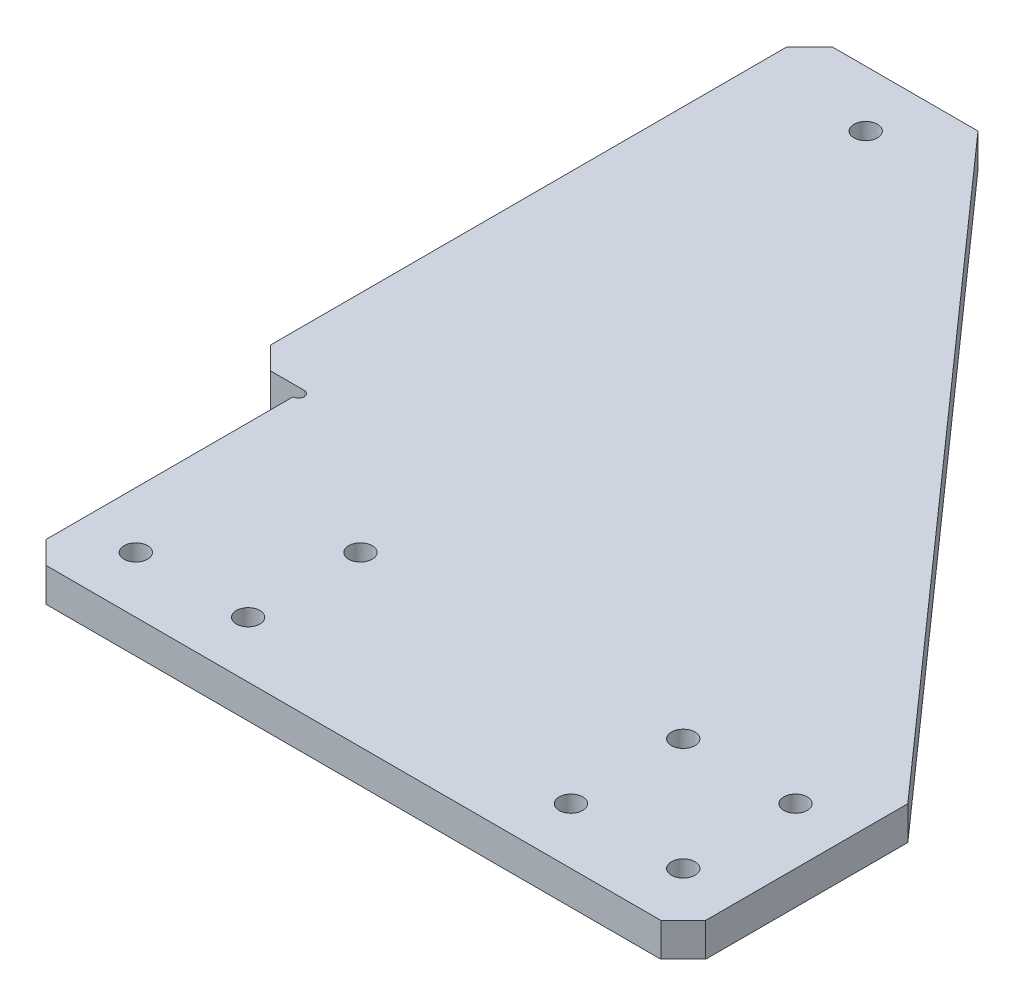
ISO-10303-21;
HEADER;
FILE_DESCRIPTION(('STEP AP214'),'2;1');
FILE_NAME('part.step','',(''),(''),'','','');
FILE_SCHEMA(('AUTOMOTIVE_DESIGN { 1 0 10303 214 1 1 1 1 }'));
ENDSEC;
DATA;
#1=APPLICATION_CONTEXT('core data for automotive mechanical design processes');
#2=APPLICATION_PROTOCOL_DEFINITION('international standard','automotive_design',2000,#1);
#3=PRODUCT_CONTEXT('',#1,'mechanical');
#4=PRODUCT('Part','Part','',(#3));
#5=PRODUCT_RELATED_PRODUCT_CATEGORY('part','',(#4));
#6=PRODUCT_DEFINITION_FORMATION('','',#4);
#7=PRODUCT_DEFINITION_CONTEXT('part definition',#1,'design');
#8=PRODUCT_DEFINITION('design','',#6,#7);
#9=PRODUCT_DEFINITION_SHAPE('','',#8);
#10=(LENGTH_UNIT() NAMED_UNIT(*) SI_UNIT(.MILLI.,.METRE.));
#11=(NAMED_UNIT(*) PLANE_ANGLE_UNIT() SI_UNIT($,.RADIAN.));
#12=(NAMED_UNIT(*) SI_UNIT($,.STERADIAN.) SOLID_ANGLE_UNIT());
#13=UNCERTAINTY_MEASURE_WITH_UNIT(LENGTH_MEASURE(1.E-05),#10,'distance_accuracy_value','');
#14=(GEOMETRIC_REPRESENTATION_CONTEXT(3) GLOBAL_UNCERTAINTY_ASSIGNED_CONTEXT((#13)) GLOBAL_UNIT_ASSIGNED_CONTEXT((#10,
#11,#12)) REPRESENTATION_CONTEXT('',''));
#15=CARTESIAN_POINT('',(0.,0.,0.));
#16=DIRECTION('',(0.,0.,1.));
#17=DIRECTION('',(1.,0.,0.));
#18=AXIS2_PLACEMENT_3D('',#15,#16,#17);
#19=CARTESIAN_POINT('',(0.,3.,0.));
#20=DIRECTION('',(0.,1.,0.));
#21=DIRECTION('',(0.,0.,1.));
#22=AXIS2_PLACEMENT_3D('',#19,#20,#21);
#23=PLANE('',#22);
#24=DIRECTION('',(-1.,0.,0.));
#25=VECTOR('',#24,1.);
#26=CARTESIAN_POINT('',(-38.75,3.,-150.));
#27=LINE('',#26,#25);
#28=CARTESIAN_POINT('',(-38.75,3.,-150.));
#29=VERTEX_POINT('',#28);
#30=CARTESIAN_POINT('',(-64.75,3.,-150.));
#31=VERTEX_POINT('',#30);
#32=EDGE_CURVE('E321',#29,#31,#27,.T.);
#33=ORIENTED_EDGE('',*,*,#32,.T.);
#34=DIRECTION('',(0.70710678118655,0.,-0.707106781186545));
#35=VECTOR('',#34,1.);
#36=CARTESIAN_POINT('',(-107.375,3.,-107.375000000001));
#37=LINE('',#36,#35);
#38=CARTESIAN_POINT('',(-68.75,3.,-146.));
#39=VERTEX_POINT('',#38);
#40=EDGE_CURVE('E207',#31,#39,#37,.F.);
#41=ORIENTED_EDGE('',*,*,#40,.T.);
#42=DIRECTION('',(0.,0.,1.));
#43=VECTOR('',#42,1.);
#44=CARTESIAN_POINT('',(-68.75,3.,-150.));
#45=LINE('',#44,#43);
#46=CARTESIAN_POINT('',(-68.75,3.,-54.0000000000001));
#47=VERTEX_POINT('',#46);
#48=EDGE_CURVE('E157',#39,#47,#45,.T.);
#49=ORIENTED_EDGE('',*,*,#48,.T.);
#50=DIRECTION('',(-0.707106781186548,0.,-0.707106781186548));
#51=VECTOR('',#50,1.);
#52=CARTESIAN_POINT('',(-7.37499999999999,3.,7.37499999999999));
#53=LINE('',#52,#51);
#54=CARTESIAN_POINT('',(-64.75,3.,-50.));
#55=VERTEX_POINT('',#54);
#56=EDGE_CURVE('E53',#47,#55,#53,.F.);
#57=ORIENTED_EDGE('',*,*,#56,.T.);
#58=DIRECTION('',(1.,0.,0.));
#59=VECTOR('',#58,1.);
#60=CARTESIAN_POINT('',(-68.75,3.,-50.));
#61=LINE('',#60,#59);
#62=CARTESIAN_POINT('',(-58.75,3.,-50.));
#63=VERTEX_POINT('',#62);
#64=EDGE_CURVE('E148',#55,#63,#61,.T.);
#65=ORIENTED_EDGE('',*,*,#64,.T.);
#66=CARTESIAN_POINT('',(-58.75,3.,-49.));
#67=DIRECTION('',(0.,1.,0.));
#68=DIRECTION('',(0.,0.,1.));
#69=AXIS2_PLACEMENT_3D('',#66,#67,#68);
#70=CIRCLE('',#69,0.999999999999998);
#71=CARTESIAN_POINT('',(-58.75,3.,-48.));
#72=VERTEX_POINT('',#71);
#73=EDGE_CURVE('E132',#72,#63,#70,.T.);
#74=ORIENTED_EDGE('',*,*,#73,.F.);
#75=DIRECTION('',(0.,0.,1.));
#76=VECTOR('',#75,1.);
#77=CARTESIAN_POINT('',(-58.75,3.,-50.));
#78=LINE('',#77,#76);
#79=CARTESIAN_POINT('',(-58.75,3.,-4.));
#80=VERTEX_POINT('',#79);
#81=EDGE_CURVE('E146',#72,#80,#78,.T.);
#82=ORIENTED_EDGE('',*,*,#81,.T.);
#83=DIRECTION('',(-0.707106781186548,0.,-0.707106781186548));
#84=VECTOR('',#83,1.);
#85=CARTESIAN_POINT('',(-27.375,3.,27.375));
#86=LINE('',#85,#84);
#87=CARTESIAN_POINT('',(-54.75,3.,0.));
#88=VERTEX_POINT('',#87);
#89=EDGE_CURVE('E204',#80,#88,#86,.F.);
#90=ORIENTED_EDGE('',*,*,#89,.T.);
#91=DIRECTION('',(1.,0.,0.));
#92=VECTOR('',#91,1.);
#93=CARTESIAN_POINT('',(-58.75,3.,0.));
#94=LINE('',#93,#92);
#95=CARTESIAN_POINT('',(54.7499999999999,3.,0.));
#96=VERTEX_POINT('',#95);
#97=EDGE_CURVE('E153',#88,#96,#94,.T.);
#98=ORIENTED_EDGE('',*,*,#97,.T.);
#99=DIRECTION('',(-0.70710678118655,0.,0.707106781186545));
#100=VECTOR('',#99,1.);
#101=CARTESIAN_POINT('',(27.3749999999998,3.,27.375));
#102=LINE('',#101,#100);
#103=CARTESIAN_POINT('',(58.75,3.,-4.00000000000003));
#104=VERTEX_POINT('',#103);
#105=EDGE_CURVE('E60',#96,#104,#102,.F.);
#106=ORIENTED_EDGE('',*,*,#105,.T.);
#107=DIRECTION('',(0.,0.,-1.));
#108=VECTOR('',#107,1.);
#109=CARTESIAN_POINT('',(58.75,3.,0.));
#110=LINE('',#109,#108);
#111=CARTESIAN_POINT('',(58.75,3.,-40.));
#112=VERTEX_POINT('',#111);
#113=EDGE_CURVE('E155',#104,#112,#110,.T.);
#114=ORIENTED_EDGE('',*,*,#113,.T.);
#115=DIRECTION('',(-0.663307514315852,0.,-0.74834693922814));
#116=VECTOR('',#115,1.);
#117=CARTESIAN_POINT('',(58.75,3.,-40.));
#118=LINE('',#117,#116);
#119=EDGE_CURVE('E182',#112,#29,#118,.T.);
#120=ORIENTED_EDGE('',*,*,#119,.T.);
#121=EDGE_LOOP('',(#33,#41,#49,#57,#65,#74,#82,#90,#98,#106,#114,#120));
#122=FACE_BOUND('',#121,.T.);
#123=CARTESIAN_POINT('',(48.75,3.,-10.));
#124=DIRECTION('',(0.,1.,0.));
#125=DIRECTION('',(0.,0.,1.));
#126=AXIS2_PLACEMENT_3D('',#123,#124,#125);
#127=CIRCLE('',#126,2.1);
#128=CARTESIAN_POINT('',(48.75,3.,-7.90000000000001));
#129=VERTEX_POINT('',#128);
#130=EDGE_CURVE('E297',#129,#129,#127,.T.);
#131=ORIENTED_EDGE('',*,*,#130,.F.);
#132=EDGE_LOOP('',(#131));
#133=FACE_BOUND('',#132,.T.);
#134=CARTESIAN_POINT('',(-28.75,3.,-10.));
#135=DIRECTION('',(0.,1.,0.));
#136=DIRECTION('',(0.,0.,1.));
#137=AXIS2_PLACEMENT_3D('',#134,#135,#136);
#138=CIRCLE('',#137,2.1);
#139=CARTESIAN_POINT('',(-28.75,3.,-7.9));
#140=VERTEX_POINT('',#139);
#141=EDGE_CURVE('E305',#140,#140,#138,.T.);
#142=ORIENTED_EDGE('',*,*,#141,.F.);
#143=EDGE_LOOP('',(#142));
#144=FACE_BOUND('',#143,.T.);
#145=CARTESIAN_POINT('',(-48.75,3.,-10.));
#146=DIRECTION('',(0.,1.,0.));
#147=DIRECTION('',(0.,0.,1.));
#148=AXIS2_PLACEMENT_3D('',#145,#146,#147);
#149=CIRCLE('',#148,2.1);
#150=CARTESIAN_POINT('',(-48.75,3.,-7.9));
#151=VERTEX_POINT('',#150);
#152=EDGE_CURVE('E311',#151,#151,#149,.T.);
#153=ORIENTED_EDGE('',*,*,#152,.F.);
#154=EDGE_LOOP('',(#153));
#155=FACE_BOUND('',#154,.T.);
#156=CARTESIAN_POINT('',(-48.7500000000001,3.,-140.));
#157=DIRECTION('',(0.,1.,0.));
#158=DIRECTION('',(0.,0.,1.));
#159=AXIS2_PLACEMENT_3D('',#156,#157,#158);
#160=CIRCLE('',#159,2.1);
#161=CARTESIAN_POINT('',(-48.7500000000001,3.,-137.9));
#162=VERTEX_POINT('',#161);
#163=EDGE_CURVE('E167',#162,#162,#160,.T.);
#164=ORIENTED_EDGE('',*,*,#163,.F.);
#165=EDGE_LOOP('',(#164));
#166=FACE_BOUND('',#165,.T.);
#167=CARTESIAN_POINT('',(-28.75,3.,-30.));
#168=DIRECTION('',(0.,1.,0.));
#169=DIRECTION('',(0.,0.,1.));
#170=AXIS2_PLACEMENT_3D('',#167,#168,#169);
#171=CIRCLE('',#170,2.1);
#172=CARTESIAN_POINT('',(-28.75,3.,-27.9));
#173=VERTEX_POINT('',#172);
#174=EDGE_CURVE('E314',#173,#173,#171,.T.);
#175=ORIENTED_EDGE('',*,*,#174,.F.);
#176=EDGE_LOOP('',(#175));
#177=FACE_BOUND('',#176,.T.);
#178=CARTESIAN_POINT('',(28.75,3.,-30.));
#179=DIRECTION('',(0.,1.,0.));
#180=DIRECTION('',(0.,0.,1.));
#181=AXIS2_PLACEMENT_3D('',#178,#179,#180);
#182=CIRCLE('',#181,2.1);
#183=CARTESIAN_POINT('',(28.75,3.,-27.9));
#184=VERTEX_POINT('',#183);
#185=EDGE_CURVE('E308',#184,#184,#182,.T.);
#186=ORIENTED_EDGE('',*,*,#185,.F.);
#187=EDGE_LOOP('',(#186));
#188=FACE_BOUND('',#187,.T.);
#189=CARTESIAN_POINT('',(28.75,3.,-10.));
#190=DIRECTION('',(0.,1.,0.));
#191=DIRECTION('',(0.,0.,1.));
#192=AXIS2_PLACEMENT_3D('',#189,#190,#191);
#193=CIRCLE('',#192,2.1);
#194=CARTESIAN_POINT('',(28.75,3.,-7.9));
#195=VERTEX_POINT('',#194);
#196=EDGE_CURVE('E302',#195,#195,#193,.T.);
#197=ORIENTED_EDGE('',*,*,#196,.F.);
#198=EDGE_LOOP('',(#197));
#199=FACE_BOUND('',#198,.T.);
#200=CARTESIAN_POINT('',(48.75,3.,-30.));
#201=DIRECTION('',(0.,1.,0.));
#202=DIRECTION('',(0.,0.,1.));
#203=AXIS2_PLACEMENT_3D('',#200,#201,#202);
#204=CIRCLE('',#203,2.1);
#205=CARTESIAN_POINT('',(48.75,3.,-27.9));
#206=VERTEX_POINT('',#205);
#207=EDGE_CURVE('E294',#206,#206,#204,.T.);
#208=ORIENTED_EDGE('',*,*,#207,.F.);
#209=EDGE_LOOP('',(#208));
#210=FACE_BOUND('',#209,.T.);
#211=ADVANCED_FACE('F37',(#122,#133,#144,#155,#166,#177,#188,#199,#210),#23,.T.);
#212=CARTESIAN_POINT('',(0.,-3.,0.));
#213=DIRECTION('',(0.,1.,0.));
#214=DIRECTION('',(0.,0.,1.));
#215=AXIS2_PLACEMENT_3D('',#212,#213,#214);
#216=PLANE('',#215);
#217=CARTESIAN_POINT('',(-48.7500000000001,-3.,-140.));
#218=DIRECTION('',(0.,1.,0.));
#219=DIRECTION('',(0.,0.,1.));
#220=AXIS2_PLACEMENT_3D('',#217,#218,#219);
#221=CIRCLE('',#220,4.09999999999997);
#222=CARTESIAN_POINT('',(-48.7500000000001,-3.,-135.9));
#223=VERTEX_POINT('',#222);
#224=EDGE_CURVE('E242',#223,#223,#221,.T.);
#225=ORIENTED_EDGE('',*,*,#224,.T.);
#226=EDGE_LOOP('',(#225));
#227=FACE_BOUND('',#226,.T.);
#228=CARTESIAN_POINT('',(48.75,-3.,-30.));
#229=DIRECTION('',(0.,1.,0.));
#230=DIRECTION('',(0.,0.,1.));
#231=AXIS2_PLACEMENT_3D('',#228,#229,#230);
#232=CIRCLE('',#231,4.10000000000008);
#233=CARTESIAN_POINT('',(48.75,-3.,-25.8999999999999));
#234=VERTEX_POINT('',#233);
#235=EDGE_CURVE('E239',#234,#234,#232,.T.);
#236=ORIENTED_EDGE('',*,*,#235,.T.);
#237=EDGE_LOOP('',(#236));
#238=FACE_BOUND('',#237,.T.);
#239=CARTESIAN_POINT('',(28.75,-3.,-30.));
#240=DIRECTION('',(0.,1.,0.));
#241=DIRECTION('',(0.,0.,1.));
#242=AXIS2_PLACEMENT_3D('',#239,#240,#241);
#243=CIRCLE('',#242,4.10000000000008);
#244=CARTESIAN_POINT('',(28.75,-3.,-25.8999999999999));
#245=VERTEX_POINT('',#244);
#246=EDGE_CURVE('E236',#245,#245,#243,.T.);
#247=ORIENTED_EDGE('',*,*,#246,.T.);
#248=EDGE_LOOP('',(#247));
#249=FACE_BOUND('',#248,.T.);
#250=CARTESIAN_POINT('',(48.75,-3.,-10.));
#251=DIRECTION('',(0.,1.,0.));
#252=DIRECTION('',(0.,0.,1.));
#253=AXIS2_PLACEMENT_3D('',#250,#251,#252);
#254=CIRCLE('',#253,4.10000000000007);
#255=CARTESIAN_POINT('',(48.75,-3.,-5.89999999999994));
#256=VERTEX_POINT('',#255);
#257=EDGE_CURVE('E233',#256,#256,#254,.T.);
#258=ORIENTED_EDGE('',*,*,#257,.T.);
#259=EDGE_LOOP('',(#258));
#260=FACE_BOUND('',#259,.T.);
#261=CARTESIAN_POINT('',(28.75,-3.,-10.));
#262=DIRECTION('',(0.,1.,0.));
#263=DIRECTION('',(0.,0.,1.));
#264=AXIS2_PLACEMENT_3D('',#261,#262,#263);
#265=CIRCLE('',#264,4.10000000000008);
#266=CARTESIAN_POINT('',(28.75,-3.,-5.89999999999993));
#267=VERTEX_POINT('',#266);
#268=EDGE_CURVE('E230',#267,#267,#265,.T.);
#269=ORIENTED_EDGE('',*,*,#268,.T.);
#270=EDGE_LOOP('',(#269));
#271=FACE_BOUND('',#270,.T.);
#272=CARTESIAN_POINT('',(-28.75,-3.,-30.));
#273=DIRECTION('',(0.,1.,0.));
#274=DIRECTION('',(0.,0.,1.));
#275=AXIS2_PLACEMENT_3D('',#272,#273,#274);
#276=CIRCLE('',#275,4.10000000000007);
#277=CARTESIAN_POINT('',(-28.75,-3.,-25.8999999999999));
#278=VERTEX_POINT('',#277);
#279=EDGE_CURVE('E227',#278,#278,#276,.T.);
#280=ORIENTED_EDGE('',*,*,#279,.T.);
#281=EDGE_LOOP('',(#280));
#282=FACE_BOUND('',#281,.T.);
#283=CARTESIAN_POINT('',(-28.75,-3.,-10.));
#284=DIRECTION('',(0.,1.,0.));
#285=DIRECTION('',(0.,0.,1.));
#286=AXIS2_PLACEMENT_3D('',#283,#284,#285);
#287=CIRCLE('',#286,4.09999999999999);
#288=CARTESIAN_POINT('',(-28.75,-3.,-5.90000000000001));
#289=VERTEX_POINT('',#288);
#290=EDGE_CURVE('E224',#289,#289,#287,.T.);
#291=ORIENTED_EDGE('',*,*,#290,.T.);
#292=EDGE_LOOP('',(#291));
#293=FACE_BOUND('',#292,.T.);
#294=CARTESIAN_POINT('',(-48.75,-3.,-10.));
#295=DIRECTION('',(0.,1.,0.));
#296=DIRECTION('',(0.,0.,1.));
#297=AXIS2_PLACEMENT_3D('',#294,#295,#296);
#298=CIRCLE('',#297,4.09999999999999);
#299=CARTESIAN_POINT('',(-48.75,-3.,-5.90000000000001));
#300=VERTEX_POINT('',#299);
#301=EDGE_CURVE('E221',#300,#300,#298,.T.);
#302=ORIENTED_EDGE('',*,*,#301,.T.);
#303=EDGE_LOOP('',(#302));
#304=FACE_BOUND('',#303,.T.);
#305=DIRECTION('',(0.,0.,1.));
#306=VECTOR('',#305,1.);
#307=CARTESIAN_POINT('',(-68.75,-3.,-150.));
#308=LINE('',#307,#306);
#309=CARTESIAN_POINT('',(-68.75,-3.,-146.));
#310=VERTEX_POINT('',#309);
#311=CARTESIAN_POINT('',(-68.75,-3.,-54.0000000000001));
#312=VERTEX_POINT('',#311);
#313=EDGE_CURVE('E170',#310,#312,#308,.T.);
#314=ORIENTED_EDGE('',*,*,#313,.F.);
#315=DIRECTION('',(-0.70710678118655,0.,0.707106781186545));
#316=VECTOR('',#315,1.);
#317=CARTESIAN_POINT('',(-68.75,-3.,-146.));
#318=LINE('',#317,#316);
#319=CARTESIAN_POINT('',(-64.75,-3.,-150.));
#320=VERTEX_POINT('',#319);
#321=EDGE_CURVE('E199',#310,#320,#318,.F.);
#322=ORIENTED_EDGE('',*,*,#321,.T.);
#323=DIRECTION('',(-1.,0.,0.));
#324=VECTOR('',#323,1.);
#325=CARTESIAN_POINT('',(-38.75,-3.,-150.));
#326=LINE('',#325,#324);
#327=CARTESIAN_POINT('',(-38.75,-3.,-150.));
#328=VERTEX_POINT('',#327);
#329=EDGE_CURVE('E166',#328,#320,#326,.T.);
#330=ORIENTED_EDGE('',*,*,#329,.F.);
#331=DIRECTION('',(-0.663307514315852,0.,-0.74834693922814));
#332=VECTOR('',#331,1.);
#333=CARTESIAN_POINT('',(58.75,-3.,-40.));
#334=LINE('',#333,#332);
#335=CARTESIAN_POINT('',(58.75,-3.,-40.));
#336=VERTEX_POINT('',#335);
#337=EDGE_CURVE('E163',#336,#328,#334,.T.);
#338=ORIENTED_EDGE('',*,*,#337,.F.);
#339=DIRECTION('',(0.,0.,-1.));
#340=VECTOR('',#339,1.);
#341=CARTESIAN_POINT('',(58.75,-3.,0.));
#342=LINE('',#341,#340);
#343=CARTESIAN_POINT('',(58.75,-3.,-4.00000000000003));
#344=VERTEX_POINT('',#343);
#345=EDGE_CURVE('E180',#344,#336,#342,.T.);
#346=ORIENTED_EDGE('',*,*,#345,.F.);
#347=DIRECTION('',(0.70710678118655,0.,-0.707106781186545));
#348=VECTOR('',#347,1.);
#349=CARTESIAN_POINT('',(58.75,-3.,-4.00000000000003));
#350=LINE('',#349,#348);
#351=CARTESIAN_POINT('',(54.7499999999999,-3.,0.));
#352=VERTEX_POINT('',#351);
#353=EDGE_CURVE('E197',#344,#352,#350,.F.);
#354=ORIENTED_EDGE('',*,*,#353,.T.);
#355=DIRECTION('',(1.,0.,0.));
#356=VECTOR('',#355,1.);
#357=CARTESIAN_POINT('',(-58.75,-3.,0.));
#358=LINE('',#357,#356);
#359=CARTESIAN_POINT('',(-54.75,-3.,0.));
#360=VERTEX_POINT('',#359);
#361=EDGE_CURVE('E177',#360,#352,#358,.T.);
#362=ORIENTED_EDGE('',*,*,#361,.F.);
#363=DIRECTION('',(0.707106781186548,0.,0.707106781186548));
#364=VECTOR('',#363,1.);
#365=CARTESIAN_POINT('',(-54.75,-3.,0.));
#366=LINE('',#365,#364);
#367=CARTESIAN_POINT('',(-58.75,-3.,-4.));
#368=VERTEX_POINT('',#367);
#369=EDGE_CURVE('E195',#360,#368,#366,.F.);
#370=ORIENTED_EDGE('',*,*,#369,.T.);
#371=DIRECTION('',(0.,0.,1.));
#372=VECTOR('',#371,1.);
#373=CARTESIAN_POINT('',(-58.75,-3.,-50.));
#374=LINE('',#373,#372);
#375=CARTESIAN_POINT('',(-58.75,-3.,-48.));
#376=VERTEX_POINT('',#375);
#377=EDGE_CURVE('E175',#376,#368,#374,.T.);
#378=ORIENTED_EDGE('',*,*,#377,.F.);
#379=CARTESIAN_POINT('',(-58.75,-3.,-49.));
#380=DIRECTION('',(0.,1.,0.));
#381=DIRECTION('',(0.,0.,1.));
#382=AXIS2_PLACEMENT_3D('',#379,#380,#381);
#383=CIRCLE('',#382,0.999999999999998);
#384=CARTESIAN_POINT('',(-58.75,-3.,-50.));
#385=VERTEX_POINT('',#384);
#386=EDGE_CURVE('E135',#376,#385,#383,.T.);
#387=ORIENTED_EDGE('',*,*,#386,.T.);
#388=DIRECTION('',(1.,0.,0.));
#389=VECTOR('',#388,1.);
#390=CARTESIAN_POINT('',(-68.75,-3.,-50.));
#391=LINE('',#390,#389);
#392=CARTESIAN_POINT('',(-64.75,-3.,-50.));
#393=VERTEX_POINT('',#392);
#394=EDGE_CURVE('E173',#393,#385,#391,.T.);
#395=ORIENTED_EDGE('',*,*,#394,.F.);
#396=DIRECTION('',(0.707106781186548,0.,0.707106781186548));
#397=VECTOR('',#396,1.);
#398=CARTESIAN_POINT('',(-64.75,-3.,-50.));
#399=LINE('',#398,#397);
#400=EDGE_CURVE('E193',#393,#312,#399,.F.);
#401=ORIENTED_EDGE('',*,*,#400,.T.);
#402=EDGE_LOOP('',(#314,#322,#330,#338,#346,#354,#362,#370,#378,#387,#395,#401));
#403=FACE_BOUND('',#402,.T.);
#404=ADVANCED_FACE('F274',(#227,#238,#249,#260,#271,#282,#293,#304,#403),#216,.F.);
#405=CARTESIAN_POINT('',(58.75,3.,-40.));
#406=DIRECTION('',(-0.74834693922814,0.,0.663307514315852));
#407=DIRECTION('',(0.663307514315852,0.,0.74834693922814));
#408=AXIS2_PLACEMENT_3D('',#405,#406,#407);
#409=PLANE('',#408);
#410=ORIENTED_EDGE('',*,*,#337,.T.);
#411=DIRECTION('',(0.,-1.,0.));
#412=VECTOR('',#411,1.);
#413=CARTESIAN_POINT('',(-38.75,3.,-150.));
#414=LINE('',#413,#412);
#415=EDGE_CURVE('E141',#29,#328,#414,.T.);
#416=ORIENTED_EDGE('',*,*,#415,.F.);
#417=ORIENTED_EDGE('',*,*,#119,.F.);
#418=DIRECTION('',(0.,-1.,0.));
#419=VECTOR('',#418,1.);
#420=CARTESIAN_POINT('',(58.75,3.,-40.));
#421=LINE('',#420,#419);
#422=EDGE_CURVE('E162',#112,#336,#421,.T.);
#423=ORIENTED_EDGE('',*,*,#422,.T.);
#424=EDGE_LOOP('',(#410,#416,#417,#423));
#425=FACE_BOUND('',#424,.T.);
#426=ADVANCED_FACE('F277',(#425),#409,.F.);
#427=CARTESIAN_POINT('',(-38.75,3.,-150.));
#428=DIRECTION('',(0.,0.,1.));
#429=DIRECTION('',(1.,0.,0.));
#430=AXIS2_PLACEMENT_3D('',#427,#428,#429);
#431=PLANE('',#430);
#432=ORIENTED_EDGE('',*,*,#329,.T.);
#433=DIRECTION('',(0.,1.,0.));
#434=VECTOR('',#433,1.);
#435=CARTESIAN_POINT('',(-64.75,3.,-150.));
#436=LINE('',#435,#434);
#437=EDGE_CURVE('E201',#320,#31,#436,.T.);
#438=ORIENTED_EDGE('',*,*,#437,.T.);
#439=ORIENTED_EDGE('',*,*,#32,.F.);
#440=ORIENTED_EDGE('',*,*,#415,.T.);
#441=EDGE_LOOP('',(#432,#438,#439,#440));
#442=FACE_BOUND('',#441,.T.);
#443=ADVANCED_FACE('F327',(#442),#431,.F.);
#444=CARTESIAN_POINT('',(-68.75,3.,-150.));
#445=DIRECTION('',(1.,0.,0.));
#446=DIRECTION('',(0.,0.,-1.));
#447=AXIS2_PLACEMENT_3D('',#444,#445,#446);
#448=PLANE('',#447);
#449=ORIENTED_EDGE('',*,*,#48,.F.);
#450=DIRECTION('',(0.,-1.,0.));
#451=VECTOR('',#450,1.);
#452=CARTESIAN_POINT('',(-68.75,3.,-146.));
#453=LINE('',#452,#451);
#454=EDGE_CURVE('E190',#39,#310,#453,.T.);
#455=ORIENTED_EDGE('',*,*,#454,.T.);
#456=ORIENTED_EDGE('',*,*,#313,.T.);
#457=DIRECTION('',(0.,1.,0.));
#458=VECTOR('',#457,1.);
#459=CARTESIAN_POINT('',(-68.75,3.,-54.));
#460=LINE('',#459,#458);
#461=EDGE_CURVE('E140',#312,#47,#460,.T.);
#462=ORIENTED_EDGE('',*,*,#461,.T.);
#463=EDGE_LOOP('',(#449,#455,#456,#462));
#464=FACE_BOUND('',#463,.T.);
#465=ADVANCED_FACE('F287',(#464),#448,.F.);
#466=CARTESIAN_POINT('',(-68.75,3.,-50.));
#467=DIRECTION('',(0.,0.,-1.));
#468=DIRECTION('',(-1.,0.,0.));
#469=AXIS2_PLACEMENT_3D('',#466,#467,#468);
#470=PLANE('',#469);
#471=ORIENTED_EDGE('',*,*,#64,.F.);
#472=DIRECTION('',(0.,-1.,0.));
#473=VECTOR('',#472,1.);
#474=CARTESIAN_POINT('',(-64.75,3.,-50.));
#475=LINE('',#474,#473);
#476=EDGE_CURVE('E218',#55,#393,#475,.T.);
#477=ORIENTED_EDGE('',*,*,#476,.T.);
#478=ORIENTED_EDGE('',*,*,#394,.T.);
#479=DIRECTION('',(0.,-1.,0.));
#480=VECTOR('',#479,1.);
#481=CARTESIAN_POINT('',(-58.75,3.,-50.));
#482=LINE('',#481,#480);
#483=EDGE_CURVE('E185',#63,#385,#482,.T.);
#484=ORIENTED_EDGE('',*,*,#483,.F.);
#485=EDGE_LOOP('',(#471,#477,#478,#484));
#486=FACE_BOUND('',#485,.T.);
#487=ADVANCED_FACE('F293',(#486),#470,.F.);
#488=CARTESIAN_POINT('',(-58.75,3.,-50.));
#489=DIRECTION('',(1.,0.,0.));
#490=DIRECTION('',(0.,0.,-1.));
#491=AXIS2_PLACEMENT_3D('',#488,#489,#490);
#492=PLANE('',#491);
#493=ORIENTED_EDGE('',*,*,#377,.T.);
#494=DIRECTION('',(0.,1.,0.));
#495=VECTOR('',#494,1.);
#496=CARTESIAN_POINT('',(-58.75,3.,-4.));
#497=LINE('',#496,#495);
#498=EDGE_CURVE('E152',#368,#80,#497,.T.);
#499=ORIENTED_EDGE('',*,*,#498,.T.);
#500=ORIENTED_EDGE('',*,*,#81,.F.);
#501=DIRECTION('',(0.,1.,0.));
#502=VECTOR('',#501,1.);
#503=CARTESIAN_POINT('',(-58.75,-3.,-48.));
#504=LINE('',#503,#502);
#505=EDGE_CURVE('E128',#72,#376,#504,.F.);
#506=ORIENTED_EDGE('',*,*,#505,.T.);
#507=EDGE_LOOP('',(#493,#499,#500,#506));
#508=FACE_BOUND('',#507,.T.);
#509=ADVANCED_FACE('F150',(#508),#492,.F.);
#510=CARTESIAN_POINT('',(-58.75,3.,0.));
#511=DIRECTION('',(0.,0.,-1.));
#512=DIRECTION('',(-1.,0.,0.));
#513=AXIS2_PLACEMENT_3D('',#510,#511,#512);
#514=PLANE('',#513);
#515=ORIENTED_EDGE('',*,*,#361,.T.);
#516=DIRECTION('',(0.,1.,0.));
#517=VECTOR('',#516,1.);
#518=CARTESIAN_POINT('',(54.7499999999999,3.,0.));
#519=LINE('',#518,#517);
#520=EDGE_CURVE('E215',#352,#96,#519,.T.);
#521=ORIENTED_EDGE('',*,*,#520,.T.);
#522=ORIENTED_EDGE('',*,*,#97,.F.);
#523=DIRECTION('',(0.,-1.,0.));
#524=VECTOR('',#523,1.);
#525=CARTESIAN_POINT('',(-54.75,3.,0.));
#526=LINE('',#525,#524);
#527=EDGE_CURVE('E212',#88,#360,#526,.T.);
#528=ORIENTED_EDGE('',*,*,#527,.T.);
#529=EDGE_LOOP('',(#515,#521,#522,#528));
#530=FACE_BOUND('',#529,.T.);
#531=ADVANCED_FACE('F343',(#530),#514,.F.);
#532=CARTESIAN_POINT('',(58.75,3.,0.));
#533=DIRECTION('',(-1.,0.,0.));
#534=DIRECTION('',(0.,0.,1.));
#535=AXIS2_PLACEMENT_3D('',#532,#533,#534);
#536=PLANE('',#535);
#537=ORIENTED_EDGE('',*,*,#113,.F.);
#538=DIRECTION('',(0.,-1.,0.));
#539=VECTOR('',#538,1.);
#540=CARTESIAN_POINT('',(58.75,3.,-4.00000000000003));
#541=LINE('',#540,#539);
#542=EDGE_CURVE('E209',#104,#344,#541,.T.);
#543=ORIENTED_EDGE('',*,*,#542,.T.);
#544=ORIENTED_EDGE('',*,*,#345,.T.);
#545=ORIENTED_EDGE('',*,*,#422,.F.);
#546=EDGE_LOOP('',(#537,#543,#544,#545));
#547=FACE_BOUND('',#546,.T.);
#548=ADVANCED_FACE('F336',(#547),#536,.F.);
#549=CARTESIAN_POINT('',(-48.7500000000001,3.,-140.));
#550=DIRECTION('',(0.,-1.,0.));
#551=DIRECTION('',(0.,0.,-1.));
#552=AXIS2_PLACEMENT_3D('',#549,#550,#551);
#553=CYLINDRICAL_SURFACE('',#552,2.1);
#554=CARTESIAN_POINT('',(-48.7500000000001,-1.00000000000003,-140.));
#555=DIRECTION('',(0.,1.,0.));
#556=DIRECTION('',(0.,0.,1.));
#557=AXIS2_PLACEMENT_3D('',#554,#555,#556);
#558=CIRCLE('',#557,2.1);
#559=CARTESIAN_POINT('',(-48.7500000000001,-1.00000000000003,-137.9));
#560=VERTEX_POINT('',#559);
#561=EDGE_CURVE('E245',#560,#560,#558,.F.);
#562=ORIENTED_EDGE('',*,*,#561,.T.);
#563=EDGE_LOOP('',(#562));
#564=FACE_BOUND('',#563,.T.);
#565=ORIENTED_EDGE('',*,*,#163,.T.);
#566=EDGE_LOOP('',(#565));
#567=FACE_BOUND('',#566,.T.);
#568=ADVANCED_FACE('F362',(#564,#567),#553,.F.);
#569=CARTESIAN_POINT('',(-28.75,3.,-30.));
#570=DIRECTION('',(0.,-1.,0.));
#571=DIRECTION('',(0.,0.,-1.));
#572=AXIS2_PLACEMENT_3D('',#569,#570,#571);
#573=CYLINDRICAL_SURFACE('',#572,2.1);
#574=CARTESIAN_POINT('',(-28.75,-0.999999999999932,-30.));
#575=DIRECTION('',(0.,1.,0.));
#576=DIRECTION('',(0.,0.,1.));
#577=AXIS2_PLACEMENT_3D('',#574,#575,#576);
#578=CIRCLE('',#577,2.1);
#579=CARTESIAN_POINT('',(-28.75,-0.999999999999932,-27.9));
#580=VERTEX_POINT('',#579);
#581=EDGE_CURVE('E260',#580,#580,#578,.F.);
#582=ORIENTED_EDGE('',*,*,#581,.T.);
#583=EDGE_LOOP('',(#582));
#584=FACE_BOUND('',#583,.T.);
#585=ORIENTED_EDGE('',*,*,#174,.T.);
#586=EDGE_LOOP('',(#585));
#587=FACE_BOUND('',#586,.T.);
#588=ADVANCED_FACE('F435',(#584,#587),#573,.F.);
#589=CARTESIAN_POINT('',(-48.75,3.,-10.));
#590=DIRECTION('',(0.,-1.,0.));
#591=DIRECTION('',(0.,0.,-1.));
#592=AXIS2_PLACEMENT_3D('',#589,#590,#591);
#593=CYLINDRICAL_SURFACE('',#592,2.1);
#594=CARTESIAN_POINT('',(-48.75,-1.00000000000001,-10.));
#595=DIRECTION('',(0.,1.,0.));
#596=DIRECTION('',(0.,0.,1.));
#597=AXIS2_PLACEMENT_3D('',#594,#595,#596);
#598=CIRCLE('',#597,2.1);
#599=CARTESIAN_POINT('',(-48.75,-1.00000000000001,-7.9));
#600=VERTEX_POINT('',#599);
#601=EDGE_CURVE('E11',#600,#600,#598,.F.);
#602=ORIENTED_EDGE('',*,*,#601,.T.);
#603=EDGE_LOOP('',(#602));
#604=FACE_BOUND('',#603,.T.);
#605=ORIENTED_EDGE('',*,*,#152,.T.);
#606=EDGE_LOOP('',(#605));
#607=FACE_BOUND('',#606,.T.);
#608=ADVANCED_FACE('F438',(#604,#607),#593,.F.);
#609=CARTESIAN_POINT('',(28.75,3.,-30.));
#610=DIRECTION('',(0.,-1.,0.));
#611=DIRECTION('',(0.,0.,-1.));
#612=AXIS2_PLACEMENT_3D('',#609,#610,#611);
#613=CYLINDRICAL_SURFACE('',#612,2.1);
#614=CARTESIAN_POINT('',(28.75,-0.999999999999936,-30.));
#615=DIRECTION('',(0.,1.,0.));
#616=DIRECTION('',(0.,0.,1.));
#617=AXIS2_PLACEMENT_3D('',#614,#615,#616);
#618=CIRCLE('',#617,2.1);
#619=CARTESIAN_POINT('',(28.75,-0.999999999999936,-27.9));
#620=VERTEX_POINT('',#619);
#621=EDGE_CURVE('E251',#620,#620,#618,.F.);
#622=ORIENTED_EDGE('',*,*,#621,.T.);
#623=EDGE_LOOP('',(#622));
#624=FACE_BOUND('',#623,.T.);
#625=ORIENTED_EDGE('',*,*,#185,.T.);
#626=EDGE_LOOP('',(#625));
#627=FACE_BOUND('',#626,.T.);
#628=ADVANCED_FACE('F467',(#624,#627),#613,.F.);
#629=CARTESIAN_POINT('',(-28.75,3.,-10.));
#630=DIRECTION('',(0.,-1.,0.));
#631=DIRECTION('',(0.,0.,-1.));
#632=AXIS2_PLACEMENT_3D('',#629,#630,#631);
#633=CYLINDRICAL_SURFACE('',#632,2.1);
#634=CARTESIAN_POINT('',(-28.75,-1.00000000000002,-10.));
#635=DIRECTION('',(0.,1.,0.));
#636=DIRECTION('',(0.,0.,1.));
#637=AXIS2_PLACEMENT_3D('',#634,#635,#636);
#638=CIRCLE('',#637,2.1);
#639=CARTESIAN_POINT('',(-28.75,-1.00000000000002,-7.9));
#640=VERTEX_POINT('',#639);
#641=EDGE_CURVE('E46',#640,#640,#638,.F.);
#642=ORIENTED_EDGE('',*,*,#641,.T.);
#643=EDGE_LOOP('',(#642));
#644=FACE_BOUND('',#643,.T.);
#645=ORIENTED_EDGE('',*,*,#141,.T.);
#646=EDGE_LOOP('',(#645));
#647=FACE_BOUND('',#646,.T.);
#648=ADVANCED_FACE('F265',(#644,#647),#633,.F.);
#649=CARTESIAN_POINT('',(28.75,3.,-10.));
#650=DIRECTION('',(0.,-1.,0.));
#651=DIRECTION('',(0.,0.,-1.));
#652=AXIS2_PLACEMENT_3D('',#649,#650,#651);
#653=CYLINDRICAL_SURFACE('',#652,2.1);
#654=CARTESIAN_POINT('',(28.75,-0.999999999999936,-10.));
#655=DIRECTION('',(0.,1.,0.));
#656=DIRECTION('',(0.,0.,1.));
#657=AXIS2_PLACEMENT_3D('',#654,#655,#656);
#658=CIRCLE('',#657,2.1);
#659=CARTESIAN_POINT('',(28.75,-0.999999999999936,-7.9));
#660=VERTEX_POINT('',#659);
#661=EDGE_CURVE('E257',#660,#660,#658,.F.);
#662=ORIENTED_EDGE('',*,*,#661,.T.);
#663=EDGE_LOOP('',(#662));
#664=FACE_BOUND('',#663,.T.);
#665=ORIENTED_EDGE('',*,*,#196,.T.);
#666=EDGE_LOOP('',(#665));
#667=FACE_BOUND('',#666,.T.);
#668=ADVANCED_FACE('F458',(#664,#667),#653,.F.);
#669=CARTESIAN_POINT('',(48.75,3.,-10.));
#670=DIRECTION('',(0.,-1.,0.));
#671=DIRECTION('',(0.,0.,-1.));
#672=AXIS2_PLACEMENT_3D('',#669,#670,#671);
#673=CYLINDRICAL_SURFACE('',#672,2.1);
#674=CARTESIAN_POINT('',(48.75,-0.999999999999929,-10.));
#675=DIRECTION('',(0.,1.,0.));
#676=DIRECTION('',(0.,0.,1.));
#677=AXIS2_PLACEMENT_3D('',#674,#675,#676);
#678=CIRCLE('',#677,2.1);
#679=CARTESIAN_POINT('',(48.75,-0.999999999999929,-7.90000000000001));
#680=VERTEX_POINT('',#679);
#681=EDGE_CURVE('E254',#680,#680,#678,.F.);
#682=ORIENTED_EDGE('',*,*,#681,.T.);
#683=EDGE_LOOP('',(#682));
#684=FACE_BOUND('',#683,.T.);
#685=ORIENTED_EDGE('',*,*,#130,.T.);
#686=EDGE_LOOP('',(#685));
#687=FACE_BOUND('',#686,.T.);
#688=ADVANCED_FACE('F450',(#684,#687),#673,.F.);
#689=CARTESIAN_POINT('',(48.75,3.,-30.));
#690=DIRECTION('',(0.,-1.,0.));
#691=DIRECTION('',(0.,0.,-1.));
#692=AXIS2_PLACEMENT_3D('',#689,#690,#691);
#693=CYLINDRICAL_SURFACE('',#692,2.1);
#694=CARTESIAN_POINT('',(48.75,-0.999999999999929,-30.));
#695=DIRECTION('',(0.,1.,0.));
#696=DIRECTION('',(0.,0.,1.));
#697=AXIS2_PLACEMENT_3D('',#694,#695,#696);
#698=CIRCLE('',#697,2.1);
#699=CARTESIAN_POINT('',(48.75,-0.999999999999929,-27.9));
#700=VERTEX_POINT('',#699);
#701=EDGE_CURVE('E248',#700,#700,#698,.F.);
#702=ORIENTED_EDGE('',*,*,#701,.T.);
#703=EDGE_LOOP('',(#702));
#704=FACE_BOUND('',#703,.T.);
#705=ORIENTED_EDGE('',*,*,#207,.T.);
#706=EDGE_LOOP('',(#705));
#707=FACE_BOUND('',#706,.T.);
#708=ADVANCED_FACE('F448',(#704,#707),#693,.F.);
#709=CARTESIAN_POINT('',(-58.75,-3.,-49.));
#710=DIRECTION('',(0.,1.,0.));
#711=DIRECTION('',(0.,0.,1.));
#712=AXIS2_PLACEMENT_3D('',#709,#710,#711);
#713=CYLINDRICAL_SURFACE('',#712,0.999999999999998);
#714=ORIENTED_EDGE('',*,*,#386,.F.);
#715=ORIENTED_EDGE('',*,*,#505,.F.);
#716=ORIENTED_EDGE('',*,*,#73,.T.);
#717=ORIENTED_EDGE('',*,*,#483,.T.);
#718=EDGE_LOOP('',(#714,#715,#716,#717));
#719=FACE_BOUND('',#718,.T.);
#720=ADVANCED_FACE('F130',(#719),#713,.F.);
#721=CARTESIAN_POINT('',(-68.75,3.,-146.));
#722=DIRECTION('',(0.707106781186545,0.,0.70710678118655));
#723=DIRECTION('',(0.,-1.,0.));
#724=AXIS2_PLACEMENT_3D('',#721,#722,#723);
#725=PLANE('',#724);
#726=ORIENTED_EDGE('',*,*,#40,.F.);
#727=ORIENTED_EDGE('',*,*,#437,.F.);
#728=ORIENTED_EDGE('',*,*,#321,.F.);
#729=ORIENTED_EDGE('',*,*,#454,.F.);
#730=EDGE_LOOP('',(#726,#727,#728,#729));
#731=FACE_BOUND('',#730,.T.);
#732=ADVANCED_FACE('F324',(#731),#725,.F.);
#733=CARTESIAN_POINT('',(58.75,3.,-4.00000000000003));
#734=DIRECTION('',(-0.707106781186545,0.,-0.70710678118655));
#735=DIRECTION('',(0.,-1.,0.));
#736=AXIS2_PLACEMENT_3D('',#733,#734,#735);
#737=PLANE('',#736);
#738=ORIENTED_EDGE('',*,*,#105,.F.);
#739=ORIENTED_EDGE('',*,*,#520,.F.);
#740=ORIENTED_EDGE('',*,*,#353,.F.);
#741=ORIENTED_EDGE('',*,*,#542,.F.);
#742=EDGE_LOOP('',(#738,#739,#740,#741));
#743=FACE_BOUND('',#742,.T.);
#744=ADVANCED_FACE('F339',(#743),#737,.F.);
#745=CARTESIAN_POINT('',(-54.75,3.,0.));
#746=DIRECTION('',(0.707106781186547,0.,-0.707106781186547));
#747=DIRECTION('',(0.,-1.,0.));
#748=AXIS2_PLACEMENT_3D('',#745,#746,#747);
#749=PLANE('',#748);
#750=ORIENTED_EDGE('',*,*,#89,.F.);
#751=ORIENTED_EDGE('',*,*,#498,.F.);
#752=ORIENTED_EDGE('',*,*,#369,.F.);
#753=ORIENTED_EDGE('',*,*,#527,.F.);
#754=EDGE_LOOP('',(#750,#751,#752,#753));
#755=FACE_BOUND('',#754,.T.);
#756=ADVANCED_FACE('F346',(#755),#749,.F.);
#757=CARTESIAN_POINT('',(-64.75,3.,-50.));
#758=DIRECTION('',(0.707106781186547,0.,-0.707106781186547));
#759=DIRECTION('',(0.,-1.,0.));
#760=AXIS2_PLACEMENT_3D('',#757,#758,#759);
#761=PLANE('',#760);
#762=ORIENTED_EDGE('',*,*,#56,.F.);
#763=ORIENTED_EDGE('',*,*,#461,.F.);
#764=ORIENTED_EDGE('',*,*,#400,.F.);
#765=ORIENTED_EDGE('',*,*,#476,.F.);
#766=EDGE_LOOP('',(#762,#763,#764,#765));
#767=FACE_BOUND('',#766,.T.);
#768=ADVANCED_FACE('F290',(#767),#761,.F.);
#769=CARTESIAN_POINT('',(-48.7500000000001,-3.,-140.));
#770=DIRECTION('',(0.,-1.,0.));
#771=DIRECTION('',(0.,0.,-1.));
#772=AXIS2_PLACEMENT_3D('',#769,#770,#771);
#773=CONICAL_SURFACE('',#772,4.09999999999997,0.785398163397447);
#774=ORIENTED_EDGE('',*,*,#561,.F.);
#775=EDGE_LOOP('',(#774));
#776=FACE_BOUND('',#775,.T.);
#777=ORIENTED_EDGE('',*,*,#224,.F.);
#778=EDGE_LOOP('',(#777));
#779=FACE_BOUND('',#778,.T.);
#780=ADVANCED_FACE('F353',(#776,#779),#773,.F.);
#781=CARTESIAN_POINT('',(48.75,-3.,-30.));
#782=DIRECTION('',(0.,-1.,0.));
#783=DIRECTION('',(0.,0.,-1.));
#784=AXIS2_PLACEMENT_3D('',#781,#782,#783);
#785=CONICAL_SURFACE('',#784,4.10000000000008,0.78539816339745);
#786=ORIENTED_EDGE('',*,*,#701,.F.);
#787=EDGE_LOOP('',(#786));
#788=FACE_BOUND('',#787,.T.);
#789=ORIENTED_EDGE('',*,*,#235,.F.);
#790=EDGE_LOOP('',(#789));
#791=FACE_BOUND('',#790,.T.);
#792=ADVANCED_FACE('F400',(#788,#791),#785,.F.);
#793=CARTESIAN_POINT('',(28.75,-3.,-30.));
#794=DIRECTION('',(0.,-1.,0.));
#795=DIRECTION('',(0.,0.,-1.));
#796=AXIS2_PLACEMENT_3D('',#793,#794,#795);
#797=CONICAL_SURFACE('',#796,4.10000000000008,0.785398163397451);
#798=ORIENTED_EDGE('',*,*,#621,.F.);
#799=EDGE_LOOP('',(#798));
#800=FACE_BOUND('',#799,.T.);
#801=ORIENTED_EDGE('',*,*,#246,.F.);
#802=EDGE_LOOP('',(#801));
#803=FACE_BOUND('',#802,.T.);
#804=ADVANCED_FACE('F405',(#800,#803),#797,.F.);
#805=CARTESIAN_POINT('',(48.75,-3.,-10.));
#806=DIRECTION('',(0.,-1.,0.));
#807=DIRECTION('',(0.,0.,-1.));
#808=AXIS2_PLACEMENT_3D('',#805,#806,#807);
#809=CONICAL_SURFACE('',#808,4.10000000000007,0.78539816339745);
#810=ORIENTED_EDGE('',*,*,#681,.F.);
#811=EDGE_LOOP('',(#810));
#812=FACE_BOUND('',#811,.T.);
#813=ORIENTED_EDGE('',*,*,#257,.F.);
#814=EDGE_LOOP('',(#813));
#815=FACE_BOUND('',#814,.T.);
#816=ADVANCED_FACE('F410',(#812,#815),#809,.F.);
#817=CARTESIAN_POINT('',(28.75,-3.,-10.));
#818=DIRECTION('',(0.,-1.,0.));
#819=DIRECTION('',(0.,0.,-1.));
#820=AXIS2_PLACEMENT_3D('',#817,#818,#819);
#821=CONICAL_SURFACE('',#820,4.10000000000008,0.78539816339745);
#822=ORIENTED_EDGE('',*,*,#661,.F.);
#823=EDGE_LOOP('',(#822));
#824=FACE_BOUND('',#823,.T.);
#825=ORIENTED_EDGE('',*,*,#268,.F.);
#826=EDGE_LOOP('',(#825));
#827=FACE_BOUND('',#826,.T.);
#828=ADVANCED_FACE('F415',(#824,#827),#821,.F.);
#829=CARTESIAN_POINT('',(-28.75,-3.,-30.));
#830=DIRECTION('',(0.,-1.,0.));
#831=DIRECTION('',(0.,0.,-1.));
#832=AXIS2_PLACEMENT_3D('',#829,#830,#831);
#833=CONICAL_SURFACE('',#832,4.10000000000007,0.785398163397449);
#834=ORIENTED_EDGE('',*,*,#581,.F.);
#835=EDGE_LOOP('',(#834));
#836=FACE_BOUND('',#835,.T.);
#837=ORIENTED_EDGE('',*,*,#279,.F.);
#838=EDGE_LOOP('',(#837));
#839=FACE_BOUND('',#838,.T.);
#840=ADVANCED_FACE('F271',(#836,#839),#833,.F.);
#841=CARTESIAN_POINT('',(-28.75,-3.,-10.));
#842=DIRECTION('',(0.,-1.,0.));
#843=DIRECTION('',(0.,0.,-1.));
#844=AXIS2_PLACEMENT_3D('',#841,#842,#843);
#845=CONICAL_SURFACE('',#844,4.09999999999999,0.78539816339745);
#846=ORIENTED_EDGE('',*,*,#641,.F.);
#847=EDGE_LOOP('',(#846));
#848=FACE_BOUND('',#847,.T.);
#849=ORIENTED_EDGE('',*,*,#290,.F.);
#850=EDGE_LOOP('',(#849));
#851=FACE_BOUND('',#850,.T.);
#852=ADVANCED_FACE('F268',(#848,#851),#845,.F.);
#853=CARTESIAN_POINT('',(-48.75,-3.,-10.));
#854=DIRECTION('',(0.,-1.,0.));
#855=DIRECTION('',(0.,0.,-1.));
#856=AXIS2_PLACEMENT_3D('',#853,#854,#855);
#857=CONICAL_SURFACE('',#856,4.09999999999999,0.78539816339745);
#858=ORIENTED_EDGE('',*,*,#601,.F.);
#859=EDGE_LOOP('',(#858));
#860=FACE_BOUND('',#859,.T.);
#861=ORIENTED_EDGE('',*,*,#301,.F.);
#862=EDGE_LOOP('',(#861));
#863=FACE_BOUND('',#862,.T.);
#864=ADVANCED_FACE('F40',(#860,#863),#857,.F.);
#865=CLOSED_SHELL('',(#211,#404,#426,#443,#465,#487,#509,#531,#548,#568,#588,#608,#628,#648,
#668,#688,#708,#720,#732,#744,#756,#768,#780,#792,#804,#816,#828,#840,#852,#864));
#866=MANIFOLD_SOLID_BREP('B2',#865);
#867=ADVANCED_BREP_SHAPE_REPRESENTATION('',(#18,#866),#14);
#868=SHAPE_DEFINITION_REPRESENTATION(#9,#867);
ENDSEC;
END-ISO-10303-21;
